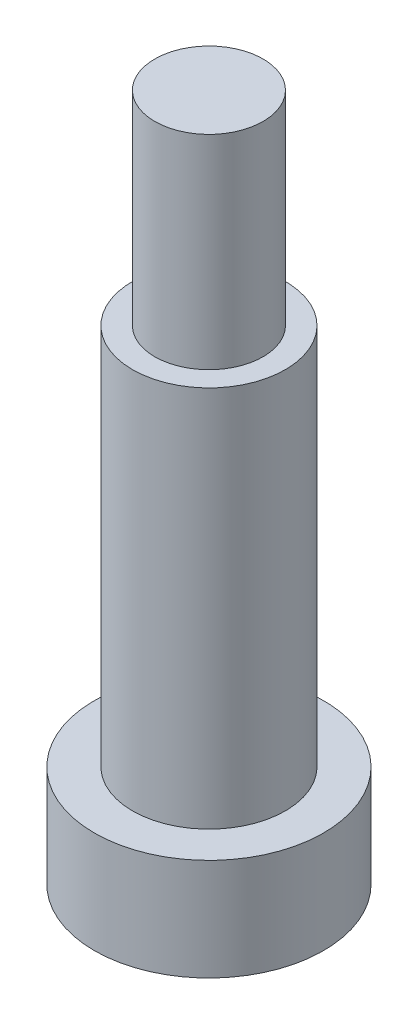
ISO-10303-21;
HEADER;
FILE_DESCRIPTION(('STEP AP214'),'2;1');
FILE_NAME('part.step','',(''),(''),'','','');
FILE_SCHEMA(('AUTOMOTIVE_DESIGN { 1 0 10303 214 1 1 1 1 }'));
ENDSEC;
DATA;
#1=APPLICATION_CONTEXT('core data for automotive mechanical design processes');
#2=APPLICATION_PROTOCOL_DEFINITION('international standard','automotive_design',2000,#1);
#3=PRODUCT_CONTEXT('',#1,'mechanical');
#4=PRODUCT('Part','Part','',(#3));
#5=PRODUCT_RELATED_PRODUCT_CATEGORY('part','',(#4));
#6=PRODUCT_DEFINITION_FORMATION('','',#4);
#7=PRODUCT_DEFINITION_CONTEXT('part definition',#1,'design');
#8=PRODUCT_DEFINITION('design','',#6,#7);
#9=PRODUCT_DEFINITION_SHAPE('','',#8);
#10=(LENGTH_UNIT() NAMED_UNIT(*) SI_UNIT(.MILLI.,.METRE.));
#11=(NAMED_UNIT(*) PLANE_ANGLE_UNIT() SI_UNIT($,.RADIAN.));
#12=(NAMED_UNIT(*) SI_UNIT($,.STERADIAN.) SOLID_ANGLE_UNIT());
#13=UNCERTAINTY_MEASURE_WITH_UNIT(LENGTH_MEASURE(1.E-05),#10,'distance_accuracy_value','');
#14=(GEOMETRIC_REPRESENTATION_CONTEXT(3) GLOBAL_UNCERTAINTY_ASSIGNED_CONTEXT((#13)) GLOBAL_UNIT_ASSIGNED_CONTEXT((#10,
#11,#12)) REPRESENTATION_CONTEXT('',''));
#15=CARTESIAN_POINT('',(0.,0.,0.));
#16=DIRECTION('',(0.,0.,1.));
#17=DIRECTION('',(1.,0.,0.));
#18=AXIS2_PLACEMENT_3D('',#15,#16,#17);
#19=CARTESIAN_POINT('',(0.,5.65,171.45));
#20=DIRECTION('',(0.,-1.,0.));
#21=DIRECTION('',(0.,0.,-1.));
#22=AXIS2_PLACEMENT_3D('',#19,#20,#21);
#23=CYLINDRICAL_SURFACE('',#22,4.25);
#24=CARTESIAN_POINT('',(0.,5.65,171.45));
#25=DIRECTION('',(0.,1.,0.));
#26=DIRECTION('',(0.,0.,1.));
#27=AXIS2_PLACEMENT_3D('',#24,#25,#26);
#28=CIRCLE('',#27,4.25);
#29=CARTESIAN_POINT('',(0.,5.65,175.7));
#30=VERTEX_POINT('',#29);
#31=EDGE_CURVE('E10',#30,#30,#28,.T.);
#32=ORIENTED_EDGE('',*,*,#31,.F.);
#33=EDGE_LOOP('',(#32));
#34=FACE_BOUND('',#33,.T.);
#35=CARTESIAN_POINT('',(0.,-10.35,171.45));
#36=DIRECTION('',(0.,1.,0.));
#37=DIRECTION('',(0.,0.,1.));
#38=AXIS2_PLACEMENT_3D('',#35,#36,#37);
#39=CIRCLE('',#38,4.25);
#40=CARTESIAN_POINT('',(0.,-10.35,175.7));
#41=VERTEX_POINT('',#40);
#42=EDGE_CURVE('E46',#41,#41,#39,.T.);
#43=ORIENTED_EDGE('',*,*,#42,.T.);
#44=EDGE_LOOP('',(#43));
#45=FACE_BOUND('',#44,.T.);
#46=ADVANCED_FACE('F43',(#34,#45),#23,.T.);
#47=CARTESIAN_POINT('',(0.,5.65,171.45));
#48=DIRECTION('',(0.,1.,0.));
#49=DIRECTION('',(0.,0.,1.));
#50=AXIS2_PLACEMENT_3D('',#47,#48,#49);
#51=PLANE('',#50);
#52=ORIENTED_EDGE('',*,*,#31,.T.);
#53=EDGE_LOOP('',(#52));
#54=FACE_BOUND('',#53,.T.);
#55=ADVANCED_FACE('F91',(#54),#51,.T.);
#56=CARTESIAN_POINT('',(0.,-10.35,171.45));
#57=DIRECTION('',(0.,-1.,0.));
#58=DIRECTION('',(0.,0.,-1.));
#59=AXIS2_PLACEMENT_3D('',#56,#57,#58);
#60=CYLINDRICAL_SURFACE('',#59,6.);
#61=CARTESIAN_POINT('',(0.,-10.35,171.45));
#62=DIRECTION('',(0.,1.,0.));
#63=DIRECTION('',(0.,0.,1.));
#64=AXIS2_PLACEMENT_3D('',#61,#62,#63);
#65=CIRCLE('',#64,6.);
#66=CARTESIAN_POINT('',(0.,-10.35,177.45));
#67=VERTEX_POINT('',#66);
#68=EDGE_CURVE('E54',#67,#67,#65,.T.);
#69=ORIENTED_EDGE('',*,*,#68,.F.);
#70=EDGE_LOOP('',(#69));
#71=FACE_BOUND('',#70,.T.);
#72=CARTESIAN_POINT('',(0.,-40.35,171.45));
#73=DIRECTION('',(0.,1.,0.));
#74=DIRECTION('',(0.,0.,1.));
#75=AXIS2_PLACEMENT_3D('',#72,#73,#74);
#76=CIRCLE('',#75,6.);
#77=CARTESIAN_POINT('',(0.,-40.35,177.45));
#78=VERTEX_POINT('',#77);
#79=EDGE_CURVE('E60',#78,#78,#76,.T.);
#80=ORIENTED_EDGE('',*,*,#79,.T.);
#81=EDGE_LOOP('',(#80));
#82=FACE_BOUND('',#81,.T.);
#83=ADVANCED_FACE('F98',(#71,#82),#60,.T.);
#84=CARTESIAN_POINT('',(0.,-10.35,171.45));
#85=DIRECTION('',(0.,1.,0.));
#86=DIRECTION('',(0.,0.,1.));
#87=AXIS2_PLACEMENT_3D('',#84,#85,#86);
#88=PLANE('',#87);
#89=ORIENTED_EDGE('',*,*,#42,.F.);
#90=EDGE_LOOP('',(#89));
#91=FACE_BOUND('',#90,.T.);
#92=ORIENTED_EDGE('',*,*,#68,.T.);
#93=EDGE_LOOP('',(#92));
#94=FACE_BOUND('',#93,.T.);
#95=ADVANCED_FACE('F105',(#91,#94),#88,.T.);
#96=CARTESIAN_POINT('',(0.,-40.35,171.45));
#97=DIRECTION('',(0.,-1.,0.));
#98=DIRECTION('',(0.,0.,-1.));
#99=AXIS2_PLACEMENT_3D('',#96,#97,#98);
#100=CYLINDRICAL_SURFACE('',#99,9.);
#101=CARTESIAN_POINT('',(0.,-40.35,171.45));
#102=DIRECTION('',(0.,1.,0.));
#103=DIRECTION('',(0.,0.,1.));
#104=AXIS2_PLACEMENT_3D('',#101,#102,#103);
#105=CIRCLE('',#104,9.);
#106=CARTESIAN_POINT('',(0.,-40.35,180.45));
#107=VERTEX_POINT('',#106);
#108=EDGE_CURVE('E63',#107,#107,#105,.T.);
#109=ORIENTED_EDGE('',*,*,#108,.F.);
#110=EDGE_LOOP('',(#109));
#111=FACE_BOUND('',#110,.T.);
#112=CARTESIAN_POINT('',(0.,-48.35,171.45));
#113=DIRECTION('',(0.,1.,0.));
#114=DIRECTION('',(0.,0.,1.));
#115=AXIS2_PLACEMENT_3D('',#112,#113,#114);
#116=CIRCLE('',#115,9.);
#117=CARTESIAN_POINT('',(0.,-48.35,180.45));
#118=VERTEX_POINT('',#117);
#119=EDGE_CURVE('E62',#118,#118,#116,.T.);
#120=ORIENTED_EDGE('',*,*,#119,.T.);
#121=EDGE_LOOP('',(#120));
#122=FACE_BOUND('',#121,.T.);
#123=ADVANCED_FACE('F104',(#111,#122),#100,.T.);
#124=CARTESIAN_POINT('',(0.,-40.35,171.45));
#125=DIRECTION('',(0.,1.,0.));
#126=DIRECTION('',(0.,0.,1.));
#127=AXIS2_PLACEMENT_3D('',#124,#125,#126);
#128=PLANE('',#127);
#129=ORIENTED_EDGE('',*,*,#79,.F.);
#130=EDGE_LOOP('',(#129));
#131=FACE_BOUND('',#130,.T.);
#132=ORIENTED_EDGE('',*,*,#108,.T.);
#133=EDGE_LOOP('',(#132));
#134=FACE_BOUND('',#133,.T.);
#135=ADVANCED_FACE('F111',(#131,#134),#128,.T.);
#136=CARTESIAN_POINT('',(0.,-48.35,171.45));
#137=DIRECTION('',(0.,1.,0.));
#138=DIRECTION('',(0.,0.,1.));
#139=AXIS2_PLACEMENT_3D('',#136,#137,#138);
#140=PLANE('',#139);
#141=CARTESIAN_POINT('',(0.,-48.35,171.45));
#142=DIRECTION('',(0.,1.,0.));
#143=DIRECTION('',(0.,0.,1.));
#144=AXIS2_PLACEMENT_3D('',#141,#142,#143);
#145=CIRCLE('',#144,3.96);
#146=CARTESIAN_POINT('',(0.,-48.35,175.41));
#147=VERTEX_POINT('',#146);
#148=EDGE_CURVE('E71',#147,#147,#145,.T.);
#149=ORIENTED_EDGE('',*,*,#148,.T.);
#150=EDGE_LOOP('',(#149));
#151=FACE_BOUND('',#150,.T.);
#152=ORIENTED_EDGE('',*,*,#119,.F.);
#153=EDGE_LOOP('',(#152));
#154=FACE_BOUND('',#153,.T.);
#155=ADVANCED_FACE('F89',(#151,#154),#140,.F.);
#156=CARTESIAN_POINT('',(0.,-43.55,171.45));
#157=DIRECTION('',(0.,-1.,0.));
#158=DIRECTION('',(0.,0.,-1.));
#159=AXIS2_PLACEMENT_3D('',#156,#157,#158);
#160=CYLINDRICAL_SURFACE('',#159,3.96);
#161=CARTESIAN_POINT('',(0.,-43.55,171.45));
#162=DIRECTION('',(0.,1.,0.));
#163=DIRECTION('',(0.,0.,1.));
#164=AXIS2_PLACEMENT_3D('',#161,#162,#163);
#165=CIRCLE('',#164,3.96);
#166=CARTESIAN_POINT('',(0.,-43.55,175.41));
#167=VERTEX_POINT('',#166);
#168=EDGE_CURVE('E69',#167,#167,#165,.T.);
#169=ORIENTED_EDGE('',*,*,#168,.T.);
#170=EDGE_LOOP('',(#169));
#171=FACE_BOUND('',#170,.T.);
#172=ORIENTED_EDGE('',*,*,#148,.F.);
#173=EDGE_LOOP('',(#172));
#174=FACE_BOUND('',#173,.T.);
#175=ADVANCED_FACE('F83',(#171,#174),#160,.F.);
#176=CARTESIAN_POINT('',(0.,-43.55,171.45));
#177=DIRECTION('',(0.,1.,0.));
#178=DIRECTION('',(0.,0.,1.));
#179=AXIS2_PLACEMENT_3D('',#176,#177,#178);
#180=PLANE('',#179);
#181=ORIENTED_EDGE('',*,*,#168,.F.);
#182=EDGE_LOOP('',(#181));
#183=FACE_BOUND('',#182,.T.);
#184=ADVANCED_FACE('F84',(#183),#180,.F.);
#185=CLOSED_SHELL('',(#46,#55,#83,#95,#123,#135,#155,#175,#184));
#186=MANIFOLD_SOLID_BREP('B2',#185);
#187=ADVANCED_BREP_SHAPE_REPRESENTATION('',(#18,#186),#14);
#188=SHAPE_DEFINITION_REPRESENTATION(#9,#187);
ENDSEC;
END-ISO-10303-21;
